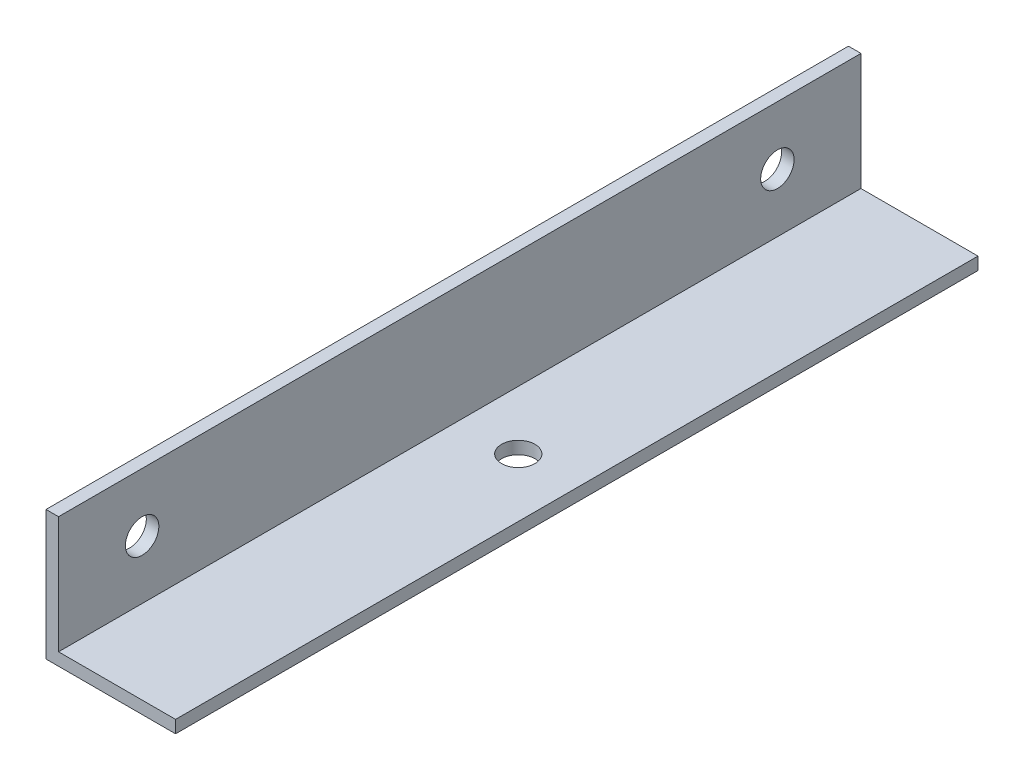
ISO-10303-21;
HEADER;
FILE_DESCRIPTION(('STEP AP214'),'2;1');
FILE_NAME('part.step','',(''),(''),'','','');
FILE_SCHEMA(('AUTOMOTIVE_DESIGN { 1 0 10303 214 1 1 1 1 }'));
ENDSEC;
DATA;
#1=APPLICATION_CONTEXT('core data for automotive mechanical design processes');
#2=APPLICATION_PROTOCOL_DEFINITION('international standard','automotive_design',2000,#1);
#3=PRODUCT_CONTEXT('',#1,'mechanical');
#4=PRODUCT('Part','Part','',(#3));
#5=PRODUCT_RELATED_PRODUCT_CATEGORY('part','',(#4));
#6=PRODUCT_DEFINITION_FORMATION('','',#4);
#7=PRODUCT_DEFINITION_CONTEXT('part definition',#1,'design');
#8=PRODUCT_DEFINITION('design','',#6,#7);
#9=PRODUCT_DEFINITION_SHAPE('','',#8);
#10=(LENGTH_UNIT() NAMED_UNIT(*) SI_UNIT(.MILLI.,.METRE.));
#11=(NAMED_UNIT(*) PLANE_ANGLE_UNIT() SI_UNIT($,.RADIAN.));
#12=(NAMED_UNIT(*) SI_UNIT($,.STERADIAN.) SOLID_ANGLE_UNIT());
#13=UNCERTAINTY_MEASURE_WITH_UNIT(LENGTH_MEASURE(1.E-05),#10,'distance_accuracy_value','');
#14=(GEOMETRIC_REPRESENTATION_CONTEXT(3) GLOBAL_UNCERTAINTY_ASSIGNED_CONTEXT((#13)) GLOBAL_UNIT_ASSIGNED_CONTEXT((#10,
#11,#12)) REPRESENTATION_CONTEXT('',''));
#15=CARTESIAN_POINT('',(0.,0.,0.));
#16=DIRECTION('',(0.,0.,1.));
#17=DIRECTION('',(1.,0.,0.));
#18=AXIS2_PLACEMENT_3D('',#15,#16,#17);
#19=CARTESIAN_POINT('',(0.,0.,96.));
#20=DIRECTION('',(0.,1.,0.));
#21=DIRECTION('',(0.,0.,1.));
#22=AXIS2_PLACEMENT_3D('',#19,#20,#21);
#23=PLANE('',#22);
#24=CARTESIAN_POINT('',(8.5,0.,48.));
#25=DIRECTION('',(0.,1.,0.));
#26=DIRECTION('',(0.,0.,1.));
#27=AXIS2_PLACEMENT_3D('',#24,#25,#26);
#28=CIRCLE('',#27,2.);
#29=CARTESIAN_POINT('',(8.5,0.,50.));
#30=VERTEX_POINT('',#29);
#31=EDGE_CURVE('E162',#30,#30,#28,.T.);
#32=ORIENTED_EDGE('',*,*,#31,.T.);
#33=EDGE_LOOP('',(#32));
#34=FACE_BOUND('',#33,.T.);
#35=DIRECTION('',(1.,0.,0.));
#36=VECTOR('',#35,1.);
#37=CARTESIAN_POINT('',(0.,0.,0.));
#38=LINE('',#37,#36);
#39=CARTESIAN_POINT('',(0.,0.,0.));
#40=VERTEX_POINT('',#39);
#41=CARTESIAN_POINT('',(15.5,0.,0.));
#42=VERTEX_POINT('',#41);
#43=EDGE_CURVE('E115',#40,#42,#38,.T.);
#44=ORIENTED_EDGE('',*,*,#43,.T.);
#45=DIRECTION('',(0.,0.,-1.));
#46=VECTOR('',#45,1.);
#47=CARTESIAN_POINT('',(15.5,0.,96.));
#48=LINE('',#47,#46);
#49=CARTESIAN_POINT('',(15.5,0.,96.));
#50=VERTEX_POINT('',#49);
#51=EDGE_CURVE('E11',#50,#42,#48,.T.);
#52=ORIENTED_EDGE('',*,*,#51,.F.);
#53=DIRECTION('',(1.,0.,0.));
#54=VECTOR('',#53,1.);
#55=CARTESIAN_POINT('',(0.,0.,96.));
#56=LINE('',#55,#54);
#57=CARTESIAN_POINT('',(0.,0.,96.));
#58=VERTEX_POINT('',#57);
#59=EDGE_CURVE('E80',#58,#50,#56,.T.);
#60=ORIENTED_EDGE('',*,*,#59,.F.);
#61=DIRECTION('',(0.,0.,-1.));
#62=VECTOR('',#61,1.);
#63=CARTESIAN_POINT('',(0.,0.,96.));
#64=LINE('',#63,#62);
#65=EDGE_CURVE('E111',#58,#40,#64,.T.);
#66=ORIENTED_EDGE('',*,*,#65,.T.);
#67=EDGE_LOOP('',(#44,#52,#60,#66));
#68=FACE_BOUND('',#67,.T.);
#69=ADVANCED_FACE('F34',(#34,#68),#23,.F.);
#70=CARTESIAN_POINT('',(15.5,1.5,96.));
#71=DIRECTION('',(1.,0.,0.));
#72=DIRECTION('',(0.,0.,-1.));
#73=AXIS2_PLACEMENT_3D('',#70,#71,#72);
#74=PLANE('',#73);
#75=DIRECTION('',(0.,-1.,0.));
#76=VECTOR('',#75,1.);
#77=CARTESIAN_POINT('',(15.5,1.5,0.));
#78=LINE('',#77,#76);
#79=CARTESIAN_POINT('',(15.5,1.5,0.));
#80=VERTEX_POINT('',#79);
#81=EDGE_CURVE('E118',#80,#42,#78,.T.);
#82=ORIENTED_EDGE('',*,*,#81,.F.);
#83=DIRECTION('',(0.,0.,-1.));
#84=VECTOR('',#83,1.);
#85=CARTESIAN_POINT('',(15.5,1.5,96.));
#86=LINE('',#85,#84);
#87=CARTESIAN_POINT('',(15.5,1.5,96.));
#88=VERTEX_POINT('',#87);
#89=EDGE_CURVE('E42',#88,#80,#86,.T.);
#90=ORIENTED_EDGE('',*,*,#89,.F.);
#91=DIRECTION('',(0.,-1.,0.));
#92=VECTOR('',#91,1.);
#93=CARTESIAN_POINT('',(15.5,1.5,96.));
#94=LINE('',#93,#92);
#95=EDGE_CURVE('E180',#88,#50,#94,.T.);
#96=ORIENTED_EDGE('',*,*,#95,.T.);
#97=ORIENTED_EDGE('',*,*,#51,.T.);
#98=EDGE_LOOP('',(#82,#90,#96,#97));
#99=FACE_BOUND('',#98,.T.);
#100=ADVANCED_FACE('F137',(#99),#74,.T.);
#101=CARTESIAN_POINT('',(0.,1.5,96.));
#102=DIRECTION('',(0.,1.,0.));
#103=DIRECTION('',(0.,0.,1.));
#104=AXIS2_PLACEMENT_3D('',#101,#102,#103);
#105=PLANE('',#104);
#106=CARTESIAN_POINT('',(8.5,1.5,48.));
#107=DIRECTION('',(0.,1.,0.));
#108=DIRECTION('',(0.,0.,1.));
#109=AXIS2_PLACEMENT_3D('',#106,#107,#108);
#110=CIRCLE('',#109,2.);
#111=CARTESIAN_POINT('',(8.5,1.5,50.));
#112=VERTEX_POINT('',#111);
#113=EDGE_CURVE('E165',#112,#112,#110,.T.);
#114=ORIENTED_EDGE('',*,*,#113,.F.);
#115=EDGE_LOOP('',(#114));
#116=FACE_BOUND('',#115,.T.);
#117=DIRECTION('',(1.,0.,0.));
#118=VECTOR('',#117,1.);
#119=CARTESIAN_POINT('',(0.,1.5,0.));
#120=LINE('',#119,#118);
#121=CARTESIAN_POINT('',(1.5,1.5,0.));
#122=VERTEX_POINT('',#121);
#123=EDGE_CURVE('E122',#122,#80,#120,.T.);
#124=ORIENTED_EDGE('',*,*,#123,.F.);
#125=DIRECTION('',(0.,0.,-1.));
#126=VECTOR('',#125,1.);
#127=CARTESIAN_POINT('',(1.5,1.5,96.));
#128=LINE('',#127,#126);
#129=CARTESIAN_POINT('',(1.5,1.5,96.));
#130=VERTEX_POINT('',#129);
#131=EDGE_CURVE('E101',#130,#122,#128,.T.);
#132=ORIENTED_EDGE('',*,*,#131,.F.);
#133=DIRECTION('',(1.,0.,0.));
#134=VECTOR('',#133,1.);
#135=CARTESIAN_POINT('',(0.,1.5,96.));
#136=LINE('',#135,#134);
#137=EDGE_CURVE('E107',#130,#88,#136,.T.);
#138=ORIENTED_EDGE('',*,*,#137,.T.);
#139=ORIENTED_EDGE('',*,*,#89,.T.);
#140=EDGE_LOOP('',(#124,#132,#138,#139));
#141=FACE_BOUND('',#140,.T.);
#142=ADVANCED_FACE('F134',(#116,#141),#105,.T.);
#143=CARTESIAN_POINT('',(1.5,15.5,96.));
#144=DIRECTION('',(1.,0.,0.));
#145=DIRECTION('',(0.,1.,0.));
#146=AXIS2_PLACEMENT_3D('',#143,#144,#145);
#147=PLANE('',#146);
#148=CARTESIAN_POINT('',(1.5,8.5,86.));
#149=DIRECTION('',(1.,0.,0.));
#150=DIRECTION('',(0.,1.,0.));
#151=AXIS2_PLACEMENT_3D('',#148,#149,#150);
#152=CIRCLE('',#151,2.);
#153=CARTESIAN_POINT('',(1.5,10.5,86.));
#154=VERTEX_POINT('',#153);
#155=EDGE_CURVE('E174',#154,#154,#152,.T.);
#156=ORIENTED_EDGE('',*,*,#155,.F.);
#157=EDGE_LOOP('',(#156));
#158=FACE_BOUND('',#157,.T.);
#159=CARTESIAN_POINT('',(1.5,8.50000000000001,10.));
#160=DIRECTION('',(1.,0.,0.));
#161=DIRECTION('',(0.,-1.,0.));
#162=AXIS2_PLACEMENT_3D('',#159,#160,#161);
#163=CIRCLE('',#162,2.);
#164=CARTESIAN_POINT('',(1.5,6.50000000000001,10.));
#165=VERTEX_POINT('',#164);
#166=EDGE_CURVE('E164',#165,#165,#163,.T.);
#167=ORIENTED_EDGE('',*,*,#166,.F.);
#168=EDGE_LOOP('',(#167));
#169=FACE_BOUND('',#168,.T.);
#170=DIRECTION('',(0.,-1.,0.));
#171=VECTOR('',#170,1.);
#172=CARTESIAN_POINT('',(1.5,15.5,0.));
#173=LINE('',#172,#171);
#174=CARTESIAN_POINT('',(1.5,15.5,0.));
#175=VERTEX_POINT('',#174);
#176=EDGE_CURVE('E96',#175,#122,#173,.T.);
#177=ORIENTED_EDGE('',*,*,#176,.F.);
#178=DIRECTION('',(0.,0.,-1.));
#179=VECTOR('',#178,1.);
#180=CARTESIAN_POINT('',(1.5,15.5,96.));
#181=LINE('',#180,#179);
#182=CARTESIAN_POINT('',(1.5,15.5,96.));
#183=VERTEX_POINT('',#182);
#184=EDGE_CURVE('E91',#183,#175,#181,.T.);
#185=ORIENTED_EDGE('',*,*,#184,.F.);
#186=DIRECTION('',(0.,-1.,0.));
#187=VECTOR('',#186,1.);
#188=CARTESIAN_POINT('',(1.5,15.5,96.));
#189=LINE('',#188,#187);
#190=EDGE_CURVE('E94',#183,#130,#189,.T.);
#191=ORIENTED_EDGE('',*,*,#190,.T.);
#192=ORIENTED_EDGE('',*,*,#131,.T.);
#193=EDGE_LOOP('',(#177,#185,#191,#192));
#194=FACE_BOUND('',#193,.T.);
#195=ADVANCED_FACE('F93',(#158,#169,#194),#147,.T.);
#196=CARTESIAN_POINT('',(0.,15.5,96.));
#197=DIRECTION('',(0.,1.,0.));
#198=DIRECTION('',(0.,0.,1.));
#199=AXIS2_PLACEMENT_3D('',#196,#197,#198);
#200=PLANE('',#199);
#201=DIRECTION('',(1.,0.,0.));
#202=VECTOR('',#201,1.);
#203=CARTESIAN_POINT('',(0.,15.5,0.));
#204=LINE('',#203,#202);
#205=CARTESIAN_POINT('',(0.,15.5,0.));
#206=VERTEX_POINT('',#205);
#207=EDGE_CURVE('E126',#206,#175,#204,.T.);
#208=ORIENTED_EDGE('',*,*,#207,.F.);
#209=DIRECTION('',(0.,0.,-1.));
#210=VECTOR('',#209,1.);
#211=CARTESIAN_POINT('',(0.,15.5,96.));
#212=LINE('',#211,#210);
#213=CARTESIAN_POINT('',(0.,15.5,96.));
#214=VERTEX_POINT('',#213);
#215=EDGE_CURVE('E71',#214,#206,#212,.T.);
#216=ORIENTED_EDGE('',*,*,#215,.F.);
#217=DIRECTION('',(1.,0.,0.));
#218=VECTOR('',#217,1.);
#219=CARTESIAN_POINT('',(0.,15.5,96.));
#220=LINE('',#219,#218);
#221=EDGE_CURVE('E105',#214,#183,#220,.T.);
#222=ORIENTED_EDGE('',*,*,#221,.T.);
#223=ORIENTED_EDGE('',*,*,#184,.T.);
#224=EDGE_LOOP('',(#208,#216,#222,#223));
#225=FACE_BOUND('',#224,.T.);
#226=ADVANCED_FACE('F109',(#225),#200,.T.);
#227=CARTESIAN_POINT('',(0.,15.5,96.));
#228=DIRECTION('',(1.,0.,0.));
#229=DIRECTION('',(0.,1.,0.));
#230=AXIS2_PLACEMENT_3D('',#227,#228,#229);
#231=PLANE('',#230);
#232=CARTESIAN_POINT('',(0.,8.5,86.));
#233=DIRECTION('',(1.,0.,0.));
#234=DIRECTION('',(0.,1.,0.));
#235=AXIS2_PLACEMENT_3D('',#232,#233,#234);
#236=CIRCLE('',#235,2.);
#237=CARTESIAN_POINT('',(0.,10.5,86.));
#238=VERTEX_POINT('',#237);
#239=EDGE_CURVE('E119',#238,#238,#236,.T.);
#240=ORIENTED_EDGE('',*,*,#239,.T.);
#241=EDGE_LOOP('',(#240));
#242=FACE_BOUND('',#241,.T.);
#243=CARTESIAN_POINT('',(0.,8.50000000000001,10.));
#244=DIRECTION('',(1.,0.,0.));
#245=DIRECTION('',(0.,-1.,0.));
#246=AXIS2_PLACEMENT_3D('',#243,#244,#245);
#247=CIRCLE('',#246,2.);
#248=CARTESIAN_POINT('',(0.,6.50000000000001,10.));
#249=VERTEX_POINT('',#248);
#250=EDGE_CURVE('E168',#249,#249,#247,.T.);
#251=ORIENTED_EDGE('',*,*,#250,.T.);
#252=EDGE_LOOP('',(#251));
#253=FACE_BOUND('',#252,.T.);
#254=DIRECTION('',(0.,-1.,0.));
#255=VECTOR('',#254,1.);
#256=CARTESIAN_POINT('',(0.,15.5,0.));
#257=LINE('',#256,#255);
#258=EDGE_CURVE('E74',#206,#40,#257,.T.);
#259=ORIENTED_EDGE('',*,*,#258,.T.);
#260=ORIENTED_EDGE('',*,*,#65,.F.);
#261=DIRECTION('',(0.,-1.,0.));
#262=VECTOR('',#261,1.);
#263=CARTESIAN_POINT('',(0.,15.5,96.));
#264=LINE('',#263,#262);
#265=EDGE_CURVE('E50',#214,#58,#264,.T.);
#266=ORIENTED_EDGE('',*,*,#265,.F.);
#267=ORIENTED_EDGE('',*,*,#215,.T.);
#268=EDGE_LOOP('',(#259,#260,#266,#267));
#269=FACE_BOUND('',#268,.T.);
#270=ADVANCED_FACE('F142',(#242,#253,#269),#231,.F.);
#271=CARTESIAN_POINT('',(0.,0.,96.));
#272=DIRECTION('',(0.,0.,-1.));
#273=DIRECTION('',(-1.,0.,0.));
#274=AXIS2_PLACEMENT_3D('',#271,#272,#273);
#275=PLANE('',#274);
#276=ORIENTED_EDGE('',*,*,#59,.T.);
#277=ORIENTED_EDGE('',*,*,#95,.F.);
#278=ORIENTED_EDGE('',*,*,#137,.F.);
#279=ORIENTED_EDGE('',*,*,#190,.F.);
#280=ORIENTED_EDGE('',*,*,#221,.F.);
#281=ORIENTED_EDGE('',*,*,#265,.T.);
#282=EDGE_LOOP('',(#276,#277,#278,#279,#280,#281));
#283=FACE_BOUND('',#282,.T.);
#284=ADVANCED_FACE('F104',(#283),#275,.F.);
#285=CARTESIAN_POINT('',(0.,0.,0.));
#286=DIRECTION('',(0.,0.,-1.));
#287=DIRECTION('',(-1.,0.,0.));
#288=AXIS2_PLACEMENT_3D('',#285,#286,#287);
#289=PLANE('',#288);
#290=ORIENTED_EDGE('',*,*,#43,.F.);
#291=ORIENTED_EDGE('',*,*,#258,.F.);
#292=ORIENTED_EDGE('',*,*,#207,.T.);
#293=ORIENTED_EDGE('',*,*,#176,.T.);
#294=ORIENTED_EDGE('',*,*,#123,.T.);
#295=ORIENTED_EDGE('',*,*,#81,.T.);
#296=EDGE_LOOP('',(#290,#291,#292,#293,#294,#295));
#297=FACE_BOUND('',#296,.T.);
#298=ADVANCED_FACE('F140',(#297),#289,.T.);
#299=CARTESIAN_POINT('',(0.,8.50000000000001,10.));
#300=DIRECTION('',(1.,0.,0.));
#301=DIRECTION('',(0.,1.,0.));
#302=AXIS2_PLACEMENT_3D('',#299,#300,#301);
#303=CYLINDRICAL_SURFACE('',#302,2.);
#304=ORIENTED_EDGE('',*,*,#250,.F.);
#305=EDGE_LOOP('',(#304));
#306=FACE_BOUND('',#305,.T.);
#307=ORIENTED_EDGE('',*,*,#166,.T.);
#308=EDGE_LOOP('',(#307));
#309=FACE_BOUND('',#308,.T.);
#310=ADVANCED_FACE('F183',(#306,#309),#303,.F.);
#311=CARTESIAN_POINT('',(0.,8.5,86.));
#312=DIRECTION('',(1.,0.,0.));
#313=DIRECTION('',(0.,1.,0.));
#314=AXIS2_PLACEMENT_3D('',#311,#312,#313);
#315=CYLINDRICAL_SURFACE('',#314,2.);
#316=ORIENTED_EDGE('',*,*,#239,.F.);
#317=EDGE_LOOP('',(#316));
#318=FACE_BOUND('',#317,.T.);
#319=ORIENTED_EDGE('',*,*,#155,.T.);
#320=EDGE_LOOP('',(#319));
#321=FACE_BOUND('',#320,.T.);
#322=ADVANCED_FACE('F186',(#318,#321),#315,.F.);
#323=CARTESIAN_POINT('',(8.5,0.,48.));
#324=DIRECTION('',(0.,1.,0.));
#325=DIRECTION('',(0.,0.,1.));
#326=AXIS2_PLACEMENT_3D('',#323,#324,#325);
#327=CYLINDRICAL_SURFACE('',#326,2.);
#328=ORIENTED_EDGE('',*,*,#31,.F.);
#329=EDGE_LOOP('',(#328));
#330=FACE_BOUND('',#329,.T.);
#331=ORIENTED_EDGE('',*,*,#113,.T.);
#332=EDGE_LOOP('',(#331));
#333=FACE_BOUND('',#332,.T.);
#334=ADVANCED_FACE('F201',(#330,#333),#327,.F.);
#335=CLOSED_SHELL('',(#69,#100,#142,#195,#226,#270,#284,#298,#310,#322,#334));
#336=MANIFOLD_SOLID_BREP('B2',#335);
#337=ADVANCED_BREP_SHAPE_REPRESENTATION('',(#18,#336),#14);
#338=SHAPE_DEFINITION_REPRESENTATION(#9,#337);
ENDSEC;
END-ISO-10303-21;
